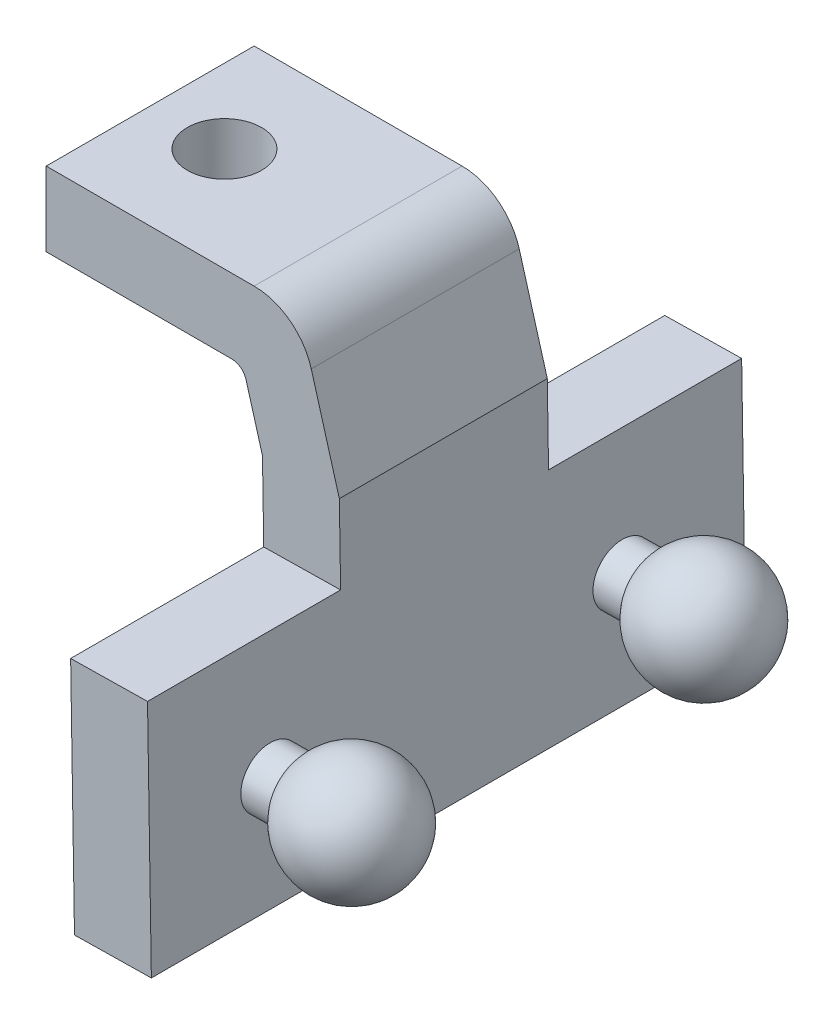
ISO-10303-21;
HEADER;
FILE_DESCRIPTION(('STEP AP214'),'2;1');
FILE_NAME('part.step','',(''),(''),'','','');
FILE_SCHEMA(('AUTOMOTIVE_DESIGN { 1 0 10303 214 1 1 1 1 }'));
ENDSEC;
DATA;
#1=APPLICATION_CONTEXT('core data for automotive mechanical design processes');
#2=APPLICATION_PROTOCOL_DEFINITION('international standard','automotive_design',2000,#1);
#3=PRODUCT_CONTEXT('',#1,'mechanical');
#4=PRODUCT('Part','Part','',(#3));
#5=PRODUCT_RELATED_PRODUCT_CATEGORY('part','',(#4));
#6=PRODUCT_DEFINITION_FORMATION('','',#4);
#7=PRODUCT_DEFINITION_CONTEXT('part definition',#1,'design');
#8=PRODUCT_DEFINITION('design','',#6,#7);
#9=PRODUCT_DEFINITION_SHAPE('','',#8);
#10=(LENGTH_UNIT() NAMED_UNIT(*) SI_UNIT(.MILLI.,.METRE.));
#11=(NAMED_UNIT(*) PLANE_ANGLE_UNIT() SI_UNIT($,.RADIAN.));
#12=(NAMED_UNIT(*) SI_UNIT($,.STERADIAN.) SOLID_ANGLE_UNIT());
#13=UNCERTAINTY_MEASURE_WITH_UNIT(LENGTH_MEASURE(1.E-05),#10,'distance_accuracy_value','');
#14=(GEOMETRIC_REPRESENTATION_CONTEXT(3) GLOBAL_UNCERTAINTY_ASSIGNED_CONTEXT((#13)) GLOBAL_UNIT_ASSIGNED_CONTEXT((#10,
#11,#12)) REPRESENTATION_CONTEXT('',''));
#15=CARTESIAN_POINT('',(0.,0.,0.));
#16=DIRECTION('',(0.,0.,1.));
#17=DIRECTION('',(1.,0.,0.));
#18=AXIS2_PLACEMENT_3D('',#15,#16,#17);
#19=CARTESIAN_POINT('',(0.,0.,3.5));
#20=DIRECTION('',(1.,0.,0.));
#21=DIRECTION('',(0.,0.,-1.));
#22=AXIS2_PLACEMENT_3D('',#19,#20,#21);
#23=PLANE('',#22);
#24=DIRECTION('',(0.,-1.,0.));
#25=VECTOR('',#24,1.);
#26=CARTESIAN_POINT('',(0.,0.,-3.5));
#27=LINE('',#26,#25);
#28=CARTESIAN_POINT('',(0.,2.5,-3.5));
#29=VERTEX_POINT('',#28);
#30=CARTESIAN_POINT('',(0.,0.,-3.5));
#31=VERTEX_POINT('',#30);
#32=EDGE_CURVE('E212',#29,#31,#27,.T.);
#33=ORIENTED_EDGE('',*,*,#32,.T.);
#34=DIRECTION('',(0.,0.,-1.));
#35=VECTOR('',#34,1.);
#36=CARTESIAN_POINT('',(0.,0.,3.5));
#37=LINE('',#36,#35);
#38=CARTESIAN_POINT('',(0.,0.,3.5));
#39=VERTEX_POINT('',#38);
#40=EDGE_CURVE('E252',#39,#31,#37,.T.);
#41=ORIENTED_EDGE('',*,*,#40,.F.);
#42=DIRECTION('',(0.,-1.,0.));
#43=VECTOR('',#42,1.);
#44=CARTESIAN_POINT('',(0.,0.,3.5));
#45=LINE('',#44,#43);
#46=CARTESIAN_POINT('',(0.,2.5,3.5));
#47=VERTEX_POINT('',#46);
#48=EDGE_CURVE('E192',#47,#39,#45,.T.);
#49=ORIENTED_EDGE('',*,*,#48,.F.);
#50=DIRECTION('',(0.,0.,-1.));
#51=VECTOR('',#50,1.);
#52=CARTESIAN_POINT('',(0.,2.5,3.5));
#53=LINE('',#52,#51);
#54=EDGE_CURVE('E211',#47,#29,#53,.T.);
#55=ORIENTED_EDGE('',*,*,#54,.T.);
#56=EDGE_LOOP('',(#33,#41,#49,#55));
#57=FACE_BOUND('',#56,.T.);
#58=ADVANCED_FACE('F41',(#57),#23,.F.);
#59=CARTESIAN_POINT('',(0.,0.,3.5));
#60=DIRECTION('',(0.,1.,0.));
#61=DIRECTION('',(0.,0.,1.));
#62=AXIS2_PLACEMENT_3D('',#59,#60,#61);
#63=PLANE('',#62);
#64=CARTESIAN_POINT('',(2.5,0.,0.));
#65=DIRECTION('',(0.,-1.,0.));
#66=DIRECTION('',(1.,0.,0.));
#67=AXIS2_PLACEMENT_3D('',#64,#65,#66);
#68=CIRCLE('',#67,1.25);
#69=CARTESIAN_POINT('',(3.75,0.,0.));
#70=VERTEX_POINT('',#69);
#71=EDGE_CURVE('E188',#70,#70,#68,.T.);
#72=ORIENTED_EDGE('',*,*,#71,.F.);
#73=EDGE_LOOP('',(#72));
#74=FACE_BOUND('',#73,.T.);
#75=DIRECTION('',(1.,0.,0.));
#76=VECTOR('',#75,1.);
#77=CARTESIAN_POINT('',(0.,0.,-3.5));
#78=LINE('',#77,#76);
#79=CARTESIAN_POINT('',(6.24543275290352,0.,-3.5));
#80=VERTEX_POINT('',#79);
#81=EDGE_CURVE('E215',#31,#80,#78,.T.);
#82=ORIENTED_EDGE('',*,*,#81,.T.);
#83=DIRECTION('',(0.,0.,-1.));
#84=VECTOR('',#83,1.);
#85=CARTESIAN_POINT('',(6.24543275290352,0.,3.5));
#86=LINE('',#85,#84);
#87=CARTESIAN_POINT('',(6.24543275290352,0.,3.5));
#88=VERTEX_POINT('',#87);
#89=EDGE_CURVE('E249',#88,#80,#86,.T.);
#90=ORIENTED_EDGE('',*,*,#89,.F.);
#91=DIRECTION('',(1.,0.,0.));
#92=VECTOR('',#91,1.);
#93=CARTESIAN_POINT('',(0.,0.,3.5));
#94=LINE('',#93,#92);
#95=EDGE_CURVE('E195',#39,#88,#94,.T.);
#96=ORIENTED_EDGE('',*,*,#95,.F.);
#97=ORIENTED_EDGE('',*,*,#40,.T.);
#98=EDGE_LOOP('',(#82,#90,#96,#97));
#99=FACE_BOUND('',#98,.T.);
#100=ADVANCED_FACE('F295',(#74,#99),#63,.F.);
#101=CARTESIAN_POINT('',(6.24543275290348,-0.5,3.5));
#102=DIRECTION('',(0.,0.,-1.));
#103=DIRECTION('',(-1.,0.,0.));
#104=AXIS2_PLACEMENT_3D('',#101,#102,#103);
#105=CYLINDRICAL_SURFACE('',#104,0.500000000000018);
#106=CARTESIAN_POINT('',(6.24543275290348,-0.5,-3.5));
#107=DIRECTION('',(0.,0.,-1.));
#108=DIRECTION('',(-1.,0.,0.));
#109=AXIS2_PLACEMENT_3D('',#106,#107,#108);
#110=CIRCLE('',#109,0.500000000000018);
#111=CARTESIAN_POINT('',(6.72624123981858,-0.362802336352139,-3.5));
#112=VERTEX_POINT('',#111);
#113=EDGE_CURVE('E217',#80,#112,#110,.T.);
#114=ORIENTED_EDGE('',*,*,#113,.T.);
#115=DIRECTION('',(0.,0.,-1.));
#116=VECTOR('',#115,1.);
#117=CARTESIAN_POINT('',(6.72624123981858,-0.362802336352139,3.5));
#118=LINE('',#117,#116);
#119=CARTESIAN_POINT('',(6.72624123981858,-0.362802336352139,3.5));
#120=VERTEX_POINT('',#119);
#121=EDGE_CURVE('E246',#120,#112,#118,.T.);
#122=ORIENTED_EDGE('',*,*,#121,.F.);
#123=CARTESIAN_POINT('',(6.24543275290348,-0.5,3.5));
#124=DIRECTION('',(0.,0.,-1.));
#125=DIRECTION('',(-1.,0.,0.));
#126=AXIS2_PLACEMENT_3D('',#123,#124,#125);
#127=CIRCLE('',#126,0.500000000000018);
#128=EDGE_CURVE('E198',#88,#120,#127,.T.);
#129=ORIENTED_EDGE('',*,*,#128,.F.);
#130=ORIENTED_EDGE('',*,*,#89,.T.);
#131=EDGE_LOOP('',(#114,#122,#129,#130));
#132=FACE_BOUND('',#131,.T.);
#133=ADVANCED_FACE('F291',(#132),#105,.F.);
#134=CARTESIAN_POINT('',(6.7262412398186,-0.362802336352134,3.5));
#135=DIRECTION('',(0.961616973830156,0.274395327295733,0.));
#136=DIRECTION('',(-0.274395327295733,0.961616973830156,0.));
#137=AXIS2_PLACEMENT_3D('',#134,#135,#136);
#138=PLANE('',#137);
#139=DIRECTION('',(0.274395327295733,-0.961616973830156,0.));
#140=VECTOR('',#139,1.);
#141=CARTESIAN_POINT('',(6.7262412398186,-0.362802336352134,-3.5));
#142=LINE('',#141,#140);
#143=CARTESIAN_POINT('',(7.28017081267278,-2.30404559589561,-3.5));
#144=VERTEX_POINT('',#143);
#145=EDGE_CURVE('E219',#112,#144,#142,.T.);
#146=ORIENTED_EDGE('',*,*,#145,.T.);
#147=DIRECTION('',(0.,0.,-1.));
#148=VECTOR('',#147,1.);
#149=CARTESIAN_POINT('',(7.28017081267278,-2.30404559589561,3.5));
#150=LINE('',#149,#148);
#151=CARTESIAN_POINT('',(7.28017081267278,-2.30404559589561,3.5));
#152=VERTEX_POINT('',#151);
#153=EDGE_CURVE('E244',#152,#144,#150,.T.);
#154=ORIENTED_EDGE('',*,*,#153,.F.);
#155=DIRECTION('',(0.274395327295733,-0.961616973830156,0.));
#156=VECTOR('',#155,1.);
#157=CARTESIAN_POINT('',(6.7262412398186,-0.362802336352134,3.5));
#158=LINE('',#157,#156);
#159=EDGE_CURVE('E200',#120,#152,#158,.T.);
#160=ORIENTED_EDGE('',*,*,#159,.F.);
#161=ORIENTED_EDGE('',*,*,#121,.T.);
#162=EDGE_LOOP('',(#146,#154,#160,#161));
#163=FACE_BOUND('',#162,.T.);
#164=ADVANCED_FACE('F286',(#163),#138,.F.);
#165=CARTESIAN_POINT('',(7.28017081267278,-2.30404559589561,3.5));
#166=DIRECTION('',(0.999869406611762,0.0161607463269063,0.));
#167=DIRECTION('',(-0.0161607463269063,0.999869406611762,0.));
#168=AXIS2_PLACEMENT_3D('',#165,#166,#167);
#169=PLANE('',#168);
#170=DIRECTION('',(0.0161607463269063,-0.999869406611762,0.));
#171=VECTOR('',#170,1.);
#172=CARTESIAN_POINT('',(7.28017081267278,-2.30404559589561,-3.5));
#173=LINE('',#172,#171);
#174=CARTESIAN_POINT('',(7.32283310818067,-4.94357246125767,-3.5));
#175=VERTEX_POINT('',#174);
#176=EDGE_CURVE('E159',#144,#175,#173,.T.);
#177=ORIENTED_EDGE('',*,*,#176,.T.);
#178=DIRECTION('',(0.,0.,1.));
#179=VECTOR('',#178,1.);
#180=CARTESIAN_POINT('',(7.32283310818067,-4.94357246125767,10.));
#181=LINE('',#180,#179);
#182=CARTESIAN_POINT('',(7.32283310818067,-4.94357246125767,-10.));
#183=VERTEX_POINT('',#182);
#184=EDGE_CURVE('E144',#183,#175,#181,.T.);
#185=ORIENTED_EDGE('',*,*,#184,.F.);
#186=DIRECTION('',(-0.0161607463269064,0.999869406611762,0.));
#187=VECTOR('',#186,1.);
#188=CARTESIAN_POINT('',(7.32283310818067,-4.94357246125767,-10.));
#189=LINE('',#188,#187);
#190=CARTESIAN_POINT('',(7.45211907879592,-12.9425277141518,-10.));
#191=VERTEX_POINT('',#190);
#192=EDGE_CURVE('E156',#191,#183,#189,.T.);
#193=ORIENTED_EDGE('',*,*,#192,.F.);
#194=DIRECTION('',(0.,0.,-1.));
#195=VECTOR('',#194,1.);
#196=CARTESIAN_POINT('',(7.45211907879592,-12.9425277141518,3.5));
#197=LINE('',#196,#195);
#198=CARTESIAN_POINT('',(7.45211907879592,-12.9425277141518,10.));
#199=VERTEX_POINT('',#198);
#200=EDGE_CURVE('E242',#199,#191,#197,.T.);
#201=ORIENTED_EDGE('',*,*,#200,.F.);
#202=DIRECTION('',(0.0161607463269064,-0.999869406611762,0.));
#203=VECTOR('',#202,1.);
#204=CARTESIAN_POINT('',(7.32283310818067,-4.94357246125767,10.));
#205=LINE('',#204,#203);
#206=CARTESIAN_POINT('',(7.32283310818067,-4.94357246125767,10.));
#207=VERTEX_POINT('',#206);
#208=EDGE_CURVE('E150',#207,#199,#205,.T.);
#209=ORIENTED_EDGE('',*,*,#208,.F.);
#210=CARTESIAN_POINT('',(7.32283310818067,-4.94357246125767,3.5));
#211=VERTEX_POINT('',#210);
#212=EDGE_CURVE('E160',#211,#207,#181,.T.);
#213=ORIENTED_EDGE('',*,*,#212,.F.);
#214=DIRECTION('',(0.0161607463269063,-0.999869406611762,0.));
#215=VECTOR('',#214,1.);
#216=CARTESIAN_POINT('',(7.28017081267278,-2.30404559589561,3.5));
#217=LINE('',#216,#215);
#218=EDGE_CURVE('E55',#152,#211,#217,.T.);
#219=ORIENTED_EDGE('',*,*,#218,.F.);
#220=ORIENTED_EDGE('',*,*,#153,.T.);
#221=EDGE_LOOP('',(#177,#185,#193,#201,#209,#213,#219,#220));
#222=FACE_BOUND('',#221,.T.);
#223=ADVANCED_FACE('F155',(#222),#169,.F.);
#224=CARTESIAN_POINT('',(7.45211907879592,-12.9425277141518,3.5));
#225=DIRECTION('',(-0.0161607463269064,0.999869406611762,0.));
#226=DIRECTION('',(-0.999869406611762,-0.0161607463269064,0.));
#227=AXIS2_PLACEMENT_3D('',#224,#225,#226);
#228=PLANE('',#227);
#229=ORIENTED_EDGE('',*,*,#200,.T.);
#230=DIRECTION('',(0.999869406611762,0.0161607463269066,0.));
#231=VECTOR('',#230,1.);
#232=CARTESIAN_POINT('',(7.45211907879592,-12.9425277141518,-10.));
#233=LINE('',#232,#231);
#234=CARTESIAN_POINT('',(10.0399715292607,-12.900700624827,-10.));
#235=VERTEX_POINT('',#234);
#236=EDGE_CURVE('E165',#191,#235,#233,.T.);
#237=ORIENTED_EDGE('',*,*,#236,.T.);
#238=DIRECTION('',(0.,0.,-1.));
#239=VECTOR('',#238,1.);
#240=CARTESIAN_POINT('',(10.0399715292607,-12.900700624827,3.5));
#241=LINE('',#240,#239);
#242=CARTESIAN_POINT('',(10.0399715292607,-12.900700624827,10.));
#243=VERTEX_POINT('',#242);
#244=EDGE_CURVE('E240',#243,#235,#241,.T.);
#245=ORIENTED_EDGE('',*,*,#244,.F.);
#246=DIRECTION('',(0.999869406611762,0.0161607463269066,0.));
#247=VECTOR('',#246,1.);
#248=CARTESIAN_POINT('',(7.45211907879592,-12.9425277141518,10.));
#249=LINE('',#248,#247);
#250=EDGE_CURVE('E182',#199,#243,#249,.T.);
#251=ORIENTED_EDGE('',*,*,#250,.F.);
#252=EDGE_LOOP('',(#229,#237,#245,#251));
#253=FACE_BOUND('',#252,.T.);
#254=ADVANCED_FACE('F282',(#253),#228,.F.);
#255=CARTESIAN_POINT('',(10.0399715292607,-12.900700624827,3.5));
#256=DIRECTION('',(-0.999869406611762,-0.0161607463269066,0.));
#257=DIRECTION('',(0.0161607463269066,-0.999869406611762,0.));
#258=AXIS2_PLACEMENT_3D('',#255,#256,#257);
#259=PLANE('',#258);
#260=CARTESIAN_POINT('',(9.97885052200131,-9.11912865879523,-5.92814502887416));
#261=DIRECTION('',(-0.999869406611762,-0.0161607463269066,0.));
#262=DIRECTION('',(-0.0161607463269066,0.999869406611762,0.));
#263=AXIS2_PLACEMENT_3D('',#260,#261,#262);
#264=CIRCLE('',#263,1.);
#265=CARTESIAN_POINT('',(9.96268977567441,-8.11925925218346,-5.92814502887416));
#266=VERTEX_POINT('',#265);
#267=EDGE_CURVE('E341',#266,#266,#264,.T.);
#268=ORIENTED_EDGE('',*,*,#267,.T.);
#269=EDGE_LOOP('',(#268));
#270=FACE_BOUND('',#269,.T.);
#271=CARTESIAN_POINT('',(9.97885052200131,-9.11912865879523,5.92814502887416));
#272=DIRECTION('',(-0.999869406611762,-0.0161607463269066,0.));
#273=DIRECTION('',(0.0161607463269066,-0.999869406611762,0.));
#274=AXIS2_PLACEMENT_3D('',#271,#272,#273);
#275=CIRCLE('',#274,1.);
#276=CARTESIAN_POINT('',(9.99501126832821,-10.118998065407,5.92814502887416));
#277=VERTEX_POINT('',#276);
#278=EDGE_CURVE('E11',#277,#277,#275,.F.);
#279=ORIENTED_EDGE('',*,*,#278,.F.);
#280=EDGE_LOOP('',(#279));
#281=FACE_BOUND('',#280,.T.);
#282=DIRECTION('',(-0.0161607463269066,0.999869406611762,0.));
#283=VECTOR('',#282,1.);
#284=CARTESIAN_POINT('',(10.0399715292607,-12.900700624827,3.5));
#285=LINE('',#284,#283);
#286=CARTESIAN_POINT('',(9.91068555864547,-4.90174537193293,3.5));
#287=VERTEX_POINT('',#286);
#288=CARTESIAN_POINT('',(9.86802326313758,-2.26221850657087,3.5));
#289=VERTEX_POINT('',#288);
#290=EDGE_CURVE('E203',#287,#289,#285,.T.);
#291=ORIENTED_EDGE('',*,*,#290,.F.);
#292=DIRECTION('',(0.,0.,1.));
#293=VECTOR('',#292,1.);
#294=CARTESIAN_POINT('',(9.91068555864547,-4.90174537193293,10.));
#295=LINE('',#294,#293);
#296=CARTESIAN_POINT('',(9.91068555864547,-4.90174537193293,10.));
#297=VERTEX_POINT('',#296);
#298=EDGE_CURVE('E178',#287,#297,#295,.T.);
#299=ORIENTED_EDGE('',*,*,#298,.T.);
#300=DIRECTION('',(0.0161607463269064,-0.999869406611762,0.));
#301=VECTOR('',#300,1.);
#302=CARTESIAN_POINT('',(9.91068555864547,-4.90174537193293,10.));
#303=LINE('',#302,#301);
#304=EDGE_CURVE('E166',#297,#243,#303,.T.);
#305=ORIENTED_EDGE('',*,*,#304,.T.);
#306=ORIENTED_EDGE('',*,*,#244,.T.);
#307=DIRECTION('',(-0.0161607463269064,0.999869406611762,0.));
#308=VECTOR('',#307,1.);
#309=CARTESIAN_POINT('',(9.91068555864547,-4.90174537193293,-10.));
#310=LINE('',#309,#308);
#311=CARTESIAN_POINT('',(9.91068555864547,-4.90174537193293,-10.));
#312=VERTEX_POINT('',#311);
#313=EDGE_CURVE('E176',#235,#312,#310,.T.);
#314=ORIENTED_EDGE('',*,*,#313,.T.);
#315=CARTESIAN_POINT('',(9.91068555864547,-4.90174537193292,-3.5));
#316=VERTEX_POINT('',#315);
#317=EDGE_CURVE('E63',#312,#316,#295,.T.);
#318=ORIENTED_EDGE('',*,*,#317,.T.);
#319=DIRECTION('',(-0.0161607463269066,0.999869406611762,0.));
#320=VECTOR('',#319,1.);
#321=CARTESIAN_POINT('',(10.0399715292607,-12.900700624827,-3.5));
#322=LINE('',#321,#320);
#323=CARTESIAN_POINT('',(9.86802326313758,-2.26221850657087,-3.5));
#324=VERTEX_POINT('',#323);
#325=EDGE_CURVE('E222',#316,#324,#322,.T.);
#326=ORIENTED_EDGE('',*,*,#325,.T.);
#327=DIRECTION('',(0.,0.,-1.));
#328=VECTOR('',#327,1.);
#329=CARTESIAN_POINT('',(9.86802326313758,-2.26221850657087,3.5));
#330=LINE('',#329,#328);
#331=EDGE_CURVE('E237',#289,#324,#330,.T.);
#332=ORIENTED_EDGE('',*,*,#331,.F.);
#333=EDGE_LOOP('',(#291,#299,#305,#306,#314,#318,#326,#332));
#334=FACE_BOUND('',#333,.T.);
#335=ADVANCED_FACE('F263',(#270,#281,#334),#259,.F.);
#336=CARTESIAN_POINT('',(9.86802326313758,-2.26221850657087,3.5));
#337=DIRECTION('',(-0.961616973830156,-0.274395327295733,0.));
#338=DIRECTION('',(0.274395327295733,-0.961616973830156,0.));
#339=AXIS2_PLACEMENT_3D('',#336,#337,#338);
#340=PLANE('',#339);
#341=DIRECTION('',(-0.274395327295733,0.961616973830156,0.));
#342=VECTOR('',#341,1.);
#343=CARTESIAN_POINT('',(9.86802326313758,-2.26221850657087,-3.5));
#344=LINE('',#343,#342);
#345=CARTESIAN_POINT('',(8.92323394766031,1.04879065459147,-3.5));
#346=VERTEX_POINT('',#345);
#347=EDGE_CURVE('E224',#324,#346,#344,.T.);
#348=ORIENTED_EDGE('',*,*,#347,.T.);
#349=DIRECTION('',(0.,0.,-1.));
#350=VECTOR('',#349,1.);
#351=CARTESIAN_POINT('',(8.92323394766031,1.04879065459147,3.5));
#352=LINE('',#351,#350);
#353=CARTESIAN_POINT('',(8.92323394766031,1.04879065459147,3.5));
#354=VERTEX_POINT('',#353);
#355=EDGE_CURVE('E234',#354,#346,#352,.T.);
#356=ORIENTED_EDGE('',*,*,#355,.F.);
#357=DIRECTION('',(-0.274395327295733,0.961616973830156,0.));
#358=VECTOR('',#357,1.);
#359=CARTESIAN_POINT('',(9.86802326313758,-2.26221850657087,3.5));
#360=LINE('',#359,#358);
#361=EDGE_CURVE('E205',#289,#354,#360,.T.);
#362=ORIENTED_EDGE('',*,*,#361,.F.);
#363=ORIENTED_EDGE('',*,*,#331,.T.);
#364=EDGE_LOOP('',(#348,#356,#362,#363));
#365=FACE_BOUND('',#364,.T.);
#366=ADVANCED_FACE('F266',(#365),#340,.F.);
#367=CARTESIAN_POINT('',(7.,0.5,3.5));
#368=DIRECTION('',(0.,0.,-1.));
#369=DIRECTION('',(-1.,0.,0.));
#370=AXIS2_PLACEMENT_3D('',#367,#368,#369);
#371=CYLINDRICAL_SURFACE('',#370,2.);
#372=CARTESIAN_POINT('',(7.,0.5,-3.5));
#373=DIRECTION('',(0.,0.,1.));
#374=DIRECTION('',(1.,0.,0.));
#375=AXIS2_PLACEMENT_3D('',#372,#373,#374);
#376=CIRCLE('',#375,2.);
#377=CARTESIAN_POINT('',(7.,2.5,-3.5));
#378=VERTEX_POINT('',#377);
#379=EDGE_CURVE('E226',#346,#378,#376,.T.);
#380=ORIENTED_EDGE('',*,*,#379,.T.);
#381=DIRECTION('',(0.,0.,-1.));
#382=VECTOR('',#381,1.);
#383=CARTESIAN_POINT('',(7.,2.5,3.5));
#384=LINE('',#383,#382);
#385=CARTESIAN_POINT('',(7.,2.5,3.5));
#386=VERTEX_POINT('',#385);
#387=EDGE_CURVE('E231',#386,#378,#384,.T.);
#388=ORIENTED_EDGE('',*,*,#387,.F.);
#389=CARTESIAN_POINT('',(7.,0.5,3.5));
#390=DIRECTION('',(0.,0.,1.));
#391=DIRECTION('',(1.,0.,0.));
#392=AXIS2_PLACEMENT_3D('',#389,#390,#391);
#393=CIRCLE('',#392,2.);
#394=EDGE_CURVE('E207',#354,#386,#393,.T.);
#395=ORIENTED_EDGE('',*,*,#394,.F.);
#396=ORIENTED_EDGE('',*,*,#355,.T.);
#397=EDGE_LOOP('',(#380,#388,#395,#396));
#398=FACE_BOUND('',#397,.T.);
#399=ADVANCED_FACE('F305',(#398),#371,.T.);
#400=CARTESIAN_POINT('',(0.,2.5,3.5));
#401=DIRECTION('',(0.,-1.,0.));
#402=DIRECTION('',(0.,0.,-1.));
#403=AXIS2_PLACEMENT_3D('',#400,#401,#402);
#404=PLANE('',#403);
#405=CARTESIAN_POINT('',(2.5,2.5,0.));
#406=DIRECTION('',(0.,-1.,0.));
#407=DIRECTION('',(0.,0.,-1.));
#408=AXIS2_PLACEMENT_3D('',#405,#406,#407);
#409=CIRCLE('',#408,1.25);
#410=CARTESIAN_POINT('',(2.5,2.5,-1.25));
#411=VERTEX_POINT('',#410);
#412=EDGE_CURVE('E191',#411,#411,#409,.T.);
#413=ORIENTED_EDGE('',*,*,#412,.T.);
#414=EDGE_LOOP('',(#413));
#415=FACE_BOUND('',#414,.T.);
#416=DIRECTION('',(-1.,0.,0.));
#417=VECTOR('',#416,1.);
#418=CARTESIAN_POINT('',(0.,2.5,-3.5));
#419=LINE('',#418,#417);
#420=EDGE_CURVE('E196',#378,#29,#419,.T.);
#421=ORIENTED_EDGE('',*,*,#420,.T.);
#422=ORIENTED_EDGE('',*,*,#54,.F.);
#423=DIRECTION('',(-1.,0.,0.));
#424=VECTOR('',#423,1.);
#425=CARTESIAN_POINT('',(0.,2.5,3.5));
#426=LINE('',#425,#424);
#427=EDGE_CURVE('E209',#386,#47,#426,.T.);
#428=ORIENTED_EDGE('',*,*,#427,.F.);
#429=ORIENTED_EDGE('',*,*,#387,.T.);
#430=EDGE_LOOP('',(#421,#422,#428,#429));
#431=FACE_BOUND('',#430,.T.);
#432=ADVANCED_FACE('F302',(#415,#431),#404,.F.);
#433=CARTESIAN_POINT('',(7.,0.5,3.5));
#434=DIRECTION('',(0.,0.,1.));
#435=DIRECTION('',(1.,0.,0.));
#436=AXIS2_PLACEMENT_3D('',#433,#434,#435);
#437=PLANE('',#436);
#438=DIRECTION('',(-0.999869406611762,-0.0161607463269066,0.));
#439=VECTOR('',#438,1.);
#440=CARTESIAN_POINT('',(7.08804501930474,-4.94736730758441,3.5));
#441=LINE('',#440,#439);
#442=EDGE_CURVE('E181',#287,#211,#441,.T.);
#443=ORIENTED_EDGE('',*,*,#442,.F.);
#444=ORIENTED_EDGE('',*,*,#290,.T.);
#445=ORIENTED_EDGE('',*,*,#361,.T.);
#446=ORIENTED_EDGE('',*,*,#394,.T.);
#447=ORIENTED_EDGE('',*,*,#427,.T.);
#448=ORIENTED_EDGE('',*,*,#48,.T.);
#449=ORIENTED_EDGE('',*,*,#95,.T.);
#450=ORIENTED_EDGE('',*,*,#128,.T.);
#451=ORIENTED_EDGE('',*,*,#159,.T.);
#452=ORIENTED_EDGE('',*,*,#218,.T.);
#453=EDGE_LOOP('',(#443,#444,#445,#446,#447,#448,#449,#450,#451,#452));
#454=FACE_BOUND('',#453,.T.);
#455=ADVANCED_FACE('F269',(#454),#437,.T.);
#456=CARTESIAN_POINT('',(7.,0.5,-3.5));
#457=DIRECTION('',(0.,0.,1.));
#458=DIRECTION('',(1.,0.,0.));
#459=AXIS2_PLACEMENT_3D('',#456,#457,#458);
#460=PLANE('',#459);
#461=ORIENTED_EDGE('',*,*,#325,.F.);
#462=DIRECTION('',(-0.999869406611762,-0.0161607463269066,0.));
#463=VECTOR('',#462,1.);
#464=CARTESIAN_POINT('',(7.08804501930474,-4.94736730758441,-3.5));
#465=LINE('',#464,#463);
#466=EDGE_CURVE('E48',#316,#175,#465,.T.);
#467=ORIENTED_EDGE('',*,*,#466,.T.);
#468=ORIENTED_EDGE('',*,*,#176,.F.);
#469=ORIENTED_EDGE('',*,*,#145,.F.);
#470=ORIENTED_EDGE('',*,*,#113,.F.);
#471=ORIENTED_EDGE('',*,*,#81,.F.);
#472=ORIENTED_EDGE('',*,*,#32,.F.);
#473=ORIENTED_EDGE('',*,*,#420,.F.);
#474=ORIENTED_EDGE('',*,*,#379,.F.);
#475=ORIENTED_EDGE('',*,*,#347,.F.);
#476=EDGE_LOOP('',(#461,#467,#468,#469,#470,#471,#472,#473,#474,#475));
#477=FACE_BOUND('',#476,.T.);
#478=ADVANCED_FACE('F258',(#477),#460,.F.);
#479=CARTESIAN_POINT('',(2.5,5.5,0.));
#480=DIRECTION('',(0.,-1.,0.));
#481=DIRECTION('',(1.,0.,0.));
#482=AXIS2_PLACEMENT_3D('',#479,#480,#481);
#483=CYLINDRICAL_SURFACE('',#482,1.25);
#484=ORIENTED_EDGE('',*,*,#71,.T.);
#485=EDGE_LOOP('',(#484));
#486=FACE_BOUND('',#485,.T.);
#487=ORIENTED_EDGE('',*,*,#412,.F.);
#488=EDGE_LOOP('',(#487));
#489=FACE_BOUND('',#488,.T.);
#490=ADVANCED_FACE('F363',(#486,#489),#483,.F.);
#491=CARTESIAN_POINT('',(7.32283310818067,-4.94357246125767,-10.));
#492=DIRECTION('',(0.,0.,-1.));
#493=DIRECTION('',(-1.,0.,0.));
#494=AXIS2_PLACEMENT_3D('',#491,#492,#493);
#495=PLANE('',#494);
#496=ORIENTED_EDGE('',*,*,#313,.F.);
#497=ORIENTED_EDGE('',*,*,#236,.F.);
#498=ORIENTED_EDGE('',*,*,#192,.T.);
#499=DIRECTION('',(0.999869406611762,0.0161607463269066,0.));
#500=VECTOR('',#499,1.);
#501=CARTESIAN_POINT('',(7.32283310818067,-4.94357246125767,-10.));
#502=LINE('',#501,#500);
#503=EDGE_CURVE('E141',#183,#312,#502,.T.);
#504=ORIENTED_EDGE('',*,*,#503,.T.);
#505=EDGE_LOOP('',(#496,#497,#498,#504));
#506=FACE_BOUND('',#505,.T.);
#507=ADVANCED_FACE('F163',(#506),#495,.T.);
#508=CARTESIAN_POINT('',(7.32283310818067,-4.94357246125767,10.));
#509=DIRECTION('',(-0.0161607463269066,0.999869406611762,0.));
#510=DIRECTION('',(-0.999869406611762,-0.0161607463269066,0.));
#511=AXIS2_PLACEMENT_3D('',#508,#509,#510);
#512=PLANE('',#511);
#513=ORIENTED_EDGE('',*,*,#466,.F.);
#514=ORIENTED_EDGE('',*,*,#317,.F.);
#515=ORIENTED_EDGE('',*,*,#503,.F.);
#516=ORIENTED_EDGE('',*,*,#184,.T.);
#517=EDGE_LOOP('',(#513,#514,#515,#516));
#518=FACE_BOUND('',#517,.T.);
#519=ADVANCED_FACE('F143',(#518),#512,.T.);
#520=CARTESIAN_POINT('',(7.32283310818067,-4.94357246125767,10.));
#521=DIRECTION('',(0.,0.,1.));
#522=DIRECTION('',(1.,0.,0.));
#523=AXIS2_PLACEMENT_3D('',#520,#521,#522);
#524=PLANE('',#523);
#525=ORIENTED_EDGE('',*,*,#304,.F.);
#526=DIRECTION('',(0.999869406611762,0.0161607463269066,0.));
#527=VECTOR('',#526,1.);
#528=CARTESIAN_POINT('',(7.32283310818067,-4.94357246125767,10.));
#529=LINE('',#528,#527);
#530=EDGE_CURVE('E149',#207,#297,#529,.T.);
#531=ORIENTED_EDGE('',*,*,#530,.F.);
#532=ORIENTED_EDGE('',*,*,#208,.T.);
#533=ORIENTED_EDGE('',*,*,#250,.T.);
#534=EDGE_LOOP('',(#525,#531,#532,#533));
#535=FACE_BOUND('',#534,.T.);
#536=ADVANCED_FACE('F279',(#535),#524,.T.);
#537=ORIENTED_EDGE('',*,*,#298,.F.);
#538=ORIENTED_EDGE('',*,*,#442,.T.);
#539=ORIENTED_EDGE('',*,*,#212,.T.);
#540=ORIENTED_EDGE('',*,*,#530,.T.);
#541=EDGE_LOOP('',(#537,#538,#539,#540));
#542=FACE_BOUND('',#541,.T.);
#543=ADVANCED_FACE('F275',(#542),#512,.T.);
#544=CARTESIAN_POINT('',(10.9787199286131,-9.10296791246832,5.92814502887416));
#545=DIRECTION('',(-0.999869406611762,-0.0161607463269066,0.));
#546=DIRECTION('',(0.0161607463269066,-0.999869406611762,0.));
#547=AXIS2_PLACEMENT_3D('',#544,#545,#546);
#548=CYLINDRICAL_SURFACE('',#547,1.);
#549=CARTESIAN_POINT('',(10.9787199286131,-9.10296791246832,5.92814502887416));
#550=DIRECTION('',(0.999869406611762,0.0161607463269066,0.));
#551=DIRECTION('',(-0.0161607463269066,0.999869406611762,0.));
#552=AXIS2_PLACEMENT_3D('',#549,#550,#551);
#553=CIRCLE('',#552,1.);
#554=CARTESIAN_POINT('',(10.9625591822862,-8.10309850585656,5.92814502887416));
#555=VERTEX_POINT('',#554);
#556=EDGE_CURVE('E171',#555,#555,#553,.T.);
#557=ORIENTED_EDGE('',*,*,#556,.F.);
#558=EDGE_LOOP('',(#557));
#559=FACE_BOUND('',#558,.T.);
#560=ORIENTED_EDGE('',*,*,#278,.T.);
#561=EDGE_LOOP('',(#560));
#562=FACE_BOUND('',#561,.T.);
#563=ADVANCED_FACE('F344',(#559,#562),#548,.T.);
#564=CARTESIAN_POINT('',(12.7105445417984,-9.07497667874189,5.92814502887416));
#565=DIRECTION('',(-0.999869406611762,-0.0161607463269066,0.));
#566=DIRECTION('',(0.,0.,1.));
#567=AXIS2_PLACEMENT_3D('',#564,#565,#566);
#568=SPHERICAL_SURFACE('',#567,2.);
#569=ORIENTED_EDGE('',*,*,#556,.T.);
#570=EDGE_LOOP('',(#569));
#571=FACE_BOUND('',#570,.T.);
#572=ADVANCED_FACE('F346',(#571),#568,.T.);
#573=CARTESIAN_POINT('',(10.9787199286131,-9.10296791246832,-5.92814502887416));
#574=DIRECTION('',(-0.999869406611762,-0.0161607463269066,0.));
#575=DIRECTION('',(0.0161607463269066,-0.999869406611762,0.));
#576=AXIS2_PLACEMENT_3D('',#573,#574,#575);
#577=CYLINDRICAL_SURFACE('',#576,1.);
#578=CARTESIAN_POINT('',(10.9787199286131,-9.10296791246832,-5.92814502887416));
#579=DIRECTION('',(0.999869406611762,0.0161607463269066,0.));
#580=DIRECTION('',(0.0161607463269066,-0.999869406611762,0.));
#581=AXIS2_PLACEMENT_3D('',#578,#579,#580);
#582=CIRCLE('',#581,0.999999999999999);
#583=CARTESIAN_POINT('',(10.99488067494,-10.1028373190801,-5.92814502887416));
#584=VERTEX_POINT('',#583);
#585=EDGE_CURVE('E429',#584,#584,#582,.T.);
#586=ORIENTED_EDGE('',*,*,#585,.F.);
#587=EDGE_LOOP('',(#586));
#588=FACE_BOUND('',#587,.T.);
#589=ORIENTED_EDGE('',*,*,#267,.F.);
#590=EDGE_LOOP('',(#589));
#591=FACE_BOUND('',#590,.T.);
#592=ADVANCED_FACE('F352',(#588,#591),#577,.T.);
#593=CARTESIAN_POINT('',(12.7105445417984,-9.07497667874189,-5.92814502887416));
#594=DIRECTION('',(-0.999869406611762,-0.0161607463269066,0.));
#595=DIRECTION('',(0.,0.,-1.));
#596=AXIS2_PLACEMENT_3D('',#593,#594,#595);
#597=SPHERICAL_SURFACE('',#596,2.);
#598=ORIENTED_EDGE('',*,*,#585,.T.);
#599=EDGE_LOOP('',(#598));
#600=FACE_BOUND('',#599,.T.);
#601=ADVANCED_FACE('F415',(#600),#597,.T.);
#602=CLOSED_SHELL('',(#58,#100,#133,#164,#223,#254,#335,#366,#399,#432,#455,#478,#490,#507,#519,
#536,#543,#563,#572,#592,#601));
#603=MANIFOLD_SOLID_BREP('B2',#602);
#604=ADVANCED_BREP_SHAPE_REPRESENTATION('',(#18,#603),#14);
#605=SHAPE_DEFINITION_REPRESENTATION(#9,#604);
ENDSEC;
END-ISO-10303-21;
